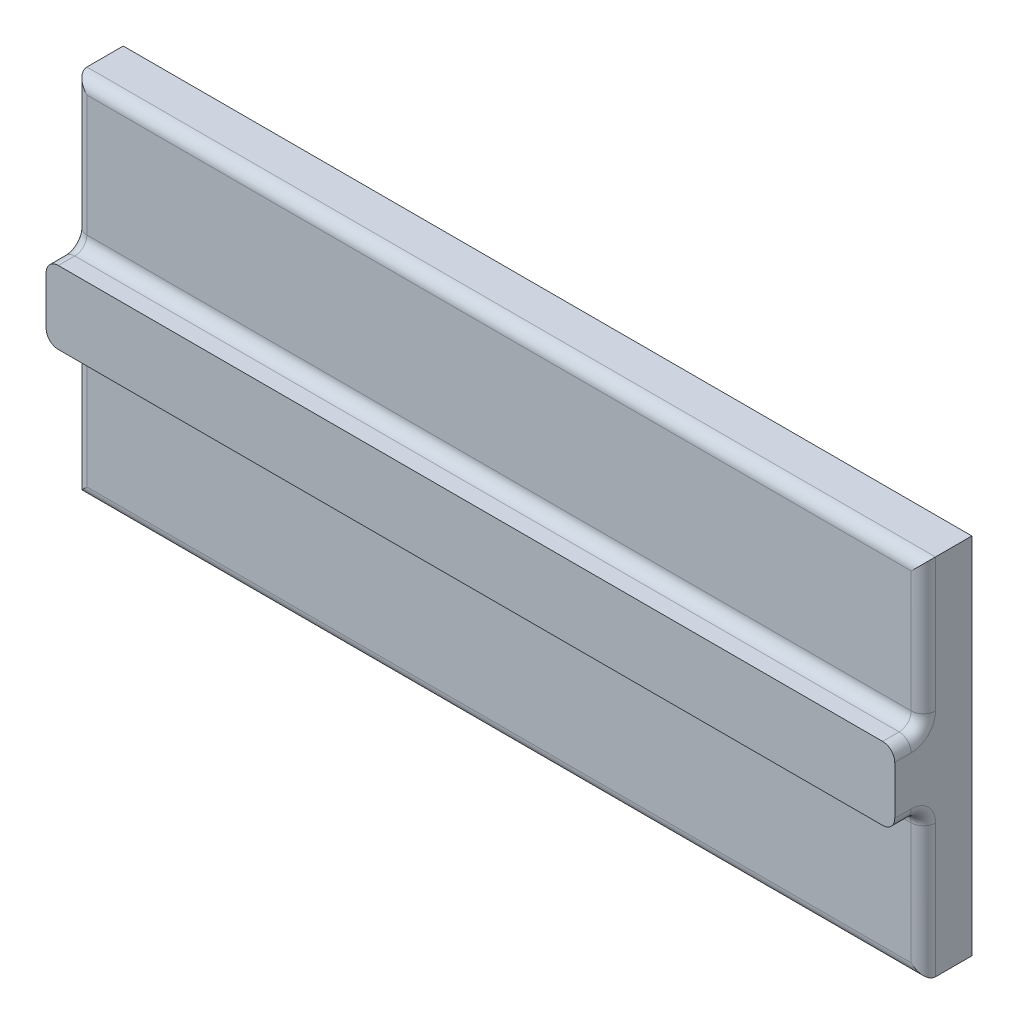
ISO-10303-21;
HEADER;
FILE_DESCRIPTION(('STEP AP214'),'2;1');
FILE_NAME('part.step','',(''),(''),'','','');
FILE_SCHEMA(('AUTOMOTIVE_DESIGN { 1 0 10303 214 1 1 1 1 }'));
ENDSEC;
DATA;
#1=APPLICATION_CONTEXT('core data for automotive mechanical design processes');
#2=APPLICATION_PROTOCOL_DEFINITION('international standard','automotive_design',2000,#1);
#3=PRODUCT_CONTEXT('',#1,'mechanical');
#4=PRODUCT('Part','Part','',(#3));
#5=PRODUCT_RELATED_PRODUCT_CATEGORY('part','',(#4));
#6=PRODUCT_DEFINITION_FORMATION('','',#4);
#7=PRODUCT_DEFINITION_CONTEXT('part definition',#1,'design');
#8=PRODUCT_DEFINITION('design','',#6,#7);
#9=PRODUCT_DEFINITION_SHAPE('','',#8);
#10=(LENGTH_UNIT() NAMED_UNIT(*) SI_UNIT(.MILLI.,.METRE.));
#11=(NAMED_UNIT(*) PLANE_ANGLE_UNIT() SI_UNIT($,.RADIAN.));
#12=(NAMED_UNIT(*) SI_UNIT($,.STERADIAN.) SOLID_ANGLE_UNIT());
#13=UNCERTAINTY_MEASURE_WITH_UNIT(LENGTH_MEASURE(1.E-05),#10,'distance_accuracy_value','');
#14=(GEOMETRIC_REPRESENTATION_CONTEXT(3) GLOBAL_UNCERTAINTY_ASSIGNED_CONTEXT((#13)) GLOBAL_UNIT_ASSIGNED_CONTEXT((#10,
#11,#12)) REPRESENTATION_CONTEXT('',''));
#15=CARTESIAN_POINT('',(0.,0.,0.));
#16=DIRECTION('',(0.,0.,1.));
#17=DIRECTION('',(1.,0.,0.));
#18=AXIS2_PLACEMENT_3D('',#15,#16,#17);
#19=CARTESIAN_POINT('',(175.,15.,10.));
#20=DIRECTION('',(0.,0.,-1.));
#21=DIRECTION('',(-1.,0.,0.));
#22=AXIS2_PLACEMENT_3D('',#19,#20,#21);
#23=PLANE('',#22);
#24=DIRECTION('',(0.,-1.,0.));
#25=VECTOR('',#24,1.);
#26=CARTESIAN_POINT('',(170.,75.,10.));
#27=LINE('',#26,#25);
#28=CARTESIAN_POINT('',(170.,20.,10.));
#29=VERTEX_POINT('',#28);
#30=CARTESIAN_POINT('',(170.,70.,10.));
#31=VERTEX_POINT('',#30);
#32=EDGE_CURVE('E307',#29,#31,#27,.F.);
#33=ORIENTED_EDGE('',*,*,#32,.T.);
#34=DIRECTION('',(-1.,0.,0.));
#35=VECTOR('',#34,1.);
#36=CARTESIAN_POINT('',(175.,70.,10.));
#37=LINE('',#36,#35);
#38=CARTESIAN_POINT('',(-170.,70.,10.));
#39=VERTEX_POINT('',#38);
#40=EDGE_CURVE('E310',#31,#39,#37,.T.);
#41=ORIENTED_EDGE('',*,*,#40,.T.);
#42=DIRECTION('',(0.,-1.,0.));
#43=VECTOR('',#42,1.);
#44=CARTESIAN_POINT('',(-170.,15.,10.));
#45=LINE('',#44,#43);
#46=CARTESIAN_POINT('',(-170.,20.,10.));
#47=VERTEX_POINT('',#46);
#48=EDGE_CURVE('E301',#39,#47,#45,.T.);
#49=ORIENTED_EDGE('',*,*,#48,.T.);
#50=DIRECTION('',(-1.,0.,0.));
#51=VECTOR('',#50,1.);
#52=CARTESIAN_POINT('',(175.,20.,10.));
#53=LINE('',#52,#51);
#54=EDGE_CURVE('E304',#47,#29,#53,.F.);
#55=ORIENTED_EDGE('',*,*,#54,.T.);
#56=EDGE_LOOP('',(#33,#41,#49,#55));
#57=FACE_BOUND('',#56,.T.);
#58=ADVANCED_FACE('F45',(#57),#23,.F.);
#59=CARTESIAN_POINT('',(175.,15.,21.7896129729729));
#60=DIRECTION('',(0.,-1.,0.));
#61=DIRECTION('',(0.,0.,-1.));
#62=AXIS2_PLACEMENT_3D('',#59,#60,#61);
#63=PLANE('',#62);
#64=DIRECTION('',(-1.,0.,0.));
#65=VECTOR('',#64,1.);
#66=CARTESIAN_POINT('',(175.,15.,21.7896129729729));
#67=LINE('',#66,#65);
#68=CARTESIAN_POINT('',(170.,15.,21.7896129729729));
#69=VERTEX_POINT('',#68);
#70=CARTESIAN_POINT('',(-170.,15.,21.7896129729729));
#71=VERTEX_POINT('',#70);
#72=EDGE_CURVE('E227',#69,#71,#67,.T.);
#73=ORIENTED_EDGE('',*,*,#72,.F.);
#74=DIRECTION('',(0.,0.,1.));
#75=VECTOR('',#74,1.);
#76=CARTESIAN_POINT('',(170.,15.,10.));
#77=LINE('',#76,#75);
#78=CARTESIAN_POINT('',(170.,15.,15.));
#79=VERTEX_POINT('',#78);
#80=EDGE_CURVE('E269',#69,#79,#77,.F.);
#81=ORIENTED_EDGE('',*,*,#80,.T.);
#82=DIRECTION('',(-1.,0.,0.));
#83=VECTOR('',#82,1.);
#84=CARTESIAN_POINT('',(-175.,15.,15.));
#85=LINE('',#84,#83);
#86=CARTESIAN_POINT('',(-170.,15.,15.));
#87=VERTEX_POINT('',#86);
#88=EDGE_CURVE('E263',#79,#87,#85,.T.);
#89=ORIENTED_EDGE('',*,*,#88,.T.);
#90=DIRECTION('',(0.,0.,1.));
#91=VECTOR('',#90,1.);
#92=CARTESIAN_POINT('',(-170.,15.,21.7896129729729));
#93=LINE('',#92,#91);
#94=EDGE_CURVE('E266',#87,#71,#93,.T.);
#95=ORIENTED_EDGE('',*,*,#94,.T.);
#96=EDGE_LOOP('',(#73,#81,#89,#95));
#97=FACE_BOUND('',#96,.T.);
#98=ADVANCED_FACE('F448',(#97),#63,.F.);
#99=CARTESIAN_POINT('',(175.,0.,21.7896129729729));
#100=DIRECTION('',(0.,0.,-1.));
#101=DIRECTION('',(-1.,0.,0.));
#102=AXIS2_PLACEMENT_3D('',#99,#100,#101);
#103=PLANE('',#102);
#104=DIRECTION('',(0.,-1.,0.));
#105=VECTOR('',#104,1.);
#106=CARTESIAN_POINT('',(175.,0.,21.7896129729729));
#107=LINE('',#106,#105);
#108=CARTESIAN_POINT('',(175.,10.,21.7896129729729));
#109=VERTEX_POINT('',#108);
#110=CARTESIAN_POINT('',(175.,-9.99999999999997,21.7896129729729));
#111=VERTEX_POINT('',#110);
#112=EDGE_CURVE('E183',#109,#111,#107,.T.);
#113=ORIENTED_EDGE('',*,*,#112,.F.);
#114=CARTESIAN_POINT('',(170.,10.,21.7896129729729));
#115=DIRECTION('',(0.,0.,-1.));
#116=DIRECTION('',(-1.,0.,0.));
#117=AXIS2_PLACEMENT_3D('',#114,#115,#116);
#118=CIRCLE('',#117,5.);
#119=EDGE_CURVE('E260',#109,#69,#118,.F.);
#120=ORIENTED_EDGE('',*,*,#119,.T.);
#121=ORIENTED_EDGE('',*,*,#72,.T.);
#122=CARTESIAN_POINT('',(-170.,10.,21.7896129729729));
#123=DIRECTION('',(0.,0.,-1.));
#124=DIRECTION('',(-1.,0.,0.));
#125=AXIS2_PLACEMENT_3D('',#122,#123,#124);
#126=CIRCLE('',#125,5.);
#127=CARTESIAN_POINT('',(-175.,10.,21.7896129729729));
#128=VERTEX_POINT('',#127);
#129=EDGE_CURVE('E258',#71,#128,#126,.F.);
#130=ORIENTED_EDGE('',*,*,#129,.T.);
#131=DIRECTION('',(0.,-1.,0.));
#132=VECTOR('',#131,1.);
#133=CARTESIAN_POINT('',(-175.,0.,21.7896129729729));
#134=LINE('',#133,#132);
#135=CARTESIAN_POINT('',(-175.,-9.99999999999997,21.7896129729729));
#136=VERTEX_POINT('',#135);
#137=EDGE_CURVE('E208',#128,#136,#134,.T.);
#138=ORIENTED_EDGE('',*,*,#137,.T.);
#139=CARTESIAN_POINT('',(-170.,-9.99999999999997,21.7896129729729));
#140=DIRECTION('',(0.,0.,-1.));
#141=DIRECTION('',(-1.,0.,0.));
#142=AXIS2_PLACEMENT_3D('',#139,#140,#141);
#143=CIRCLE('',#142,5.);
#144=CARTESIAN_POINT('',(-170.,-15.,21.7896129729729));
#145=VERTEX_POINT('',#144);
#146=EDGE_CURVE('E252',#136,#145,#143,.F.);
#147=ORIENTED_EDGE('',*,*,#146,.T.);
#148=DIRECTION('',(-1.,0.,0.));
#149=VECTOR('',#148,1.);
#150=CARTESIAN_POINT('',(175.,-15.,21.7896129729729));
#151=LINE('',#150,#149);
#152=CARTESIAN_POINT('',(170.,-15.,21.7896129729729));
#153=VERTEX_POINT('',#152);
#154=EDGE_CURVE('E193',#153,#145,#151,.T.);
#155=ORIENTED_EDGE('',*,*,#154,.F.);
#156=CARTESIAN_POINT('',(170.,-9.99999999999997,21.7896129729729));
#157=DIRECTION('',(0.,0.,-1.));
#158=DIRECTION('',(-1.,0.,0.));
#159=AXIS2_PLACEMENT_3D('',#156,#157,#158);
#160=CIRCLE('',#159,5.);
#161=EDGE_CURVE('E255',#153,#111,#160,.F.);
#162=ORIENTED_EDGE('',*,*,#161,.T.);
#163=EDGE_LOOP('',(#113,#120,#121,#130,#138,#147,#155,#162));
#164=FACE_BOUND('',#163,.T.);
#165=ADVANCED_FACE('F418',(#164),#103,.F.);
#166=CARTESIAN_POINT('',(175.,-15.,21.7896129729729));
#167=DIRECTION('',(0.,1.,0.));
#168=DIRECTION('',(0.,0.,1.));
#169=AXIS2_PLACEMENT_3D('',#166,#167,#168);
#170=PLANE('',#169);
#171=DIRECTION('',(-1.,0.,0.));
#172=VECTOR('',#171,1.);
#173=CARTESIAN_POINT('',(175.,-15.,15.));
#174=LINE('',#173,#172);
#175=CARTESIAN_POINT('',(-170.,-15.,15.));
#176=VERTEX_POINT('',#175);
#177=CARTESIAN_POINT('',(170.,-15.,15.));
#178=VERTEX_POINT('',#177);
#179=EDGE_CURVE('E292',#176,#178,#174,.F.);
#180=ORIENTED_EDGE('',*,*,#179,.T.);
#181=DIRECTION('',(0.,0.,-1.));
#182=VECTOR('',#181,1.);
#183=CARTESIAN_POINT('',(170.,-15.,21.7896129729729));
#184=LINE('',#183,#182);
#185=EDGE_CURVE('E298',#178,#153,#184,.F.);
#186=ORIENTED_EDGE('',*,*,#185,.T.);
#187=ORIENTED_EDGE('',*,*,#154,.T.);
#188=DIRECTION('',(0.,0.,-1.));
#189=VECTOR('',#188,1.);
#190=CARTESIAN_POINT('',(-170.,-15.,21.7896129729729));
#191=LINE('',#190,#189);
#192=EDGE_CURVE('E295',#145,#176,#191,.T.);
#193=ORIENTED_EDGE('',*,*,#192,.T.);
#194=EDGE_LOOP('',(#180,#186,#187,#193));
#195=FACE_BOUND('',#194,.T.);
#196=ADVANCED_FACE('F438',(#195),#170,.F.);
#197=CARTESIAN_POINT('',(175.,-75.,10.));
#198=DIRECTION('',(0.,0.,-1.));
#199=DIRECTION('',(-1.,0.,0.));
#200=AXIS2_PLACEMENT_3D('',#197,#198,#199);
#201=PLANE('',#200);
#202=DIRECTION('',(0.,-1.,0.));
#203=VECTOR('',#202,1.);
#204=CARTESIAN_POINT('',(170.,-15.,10.));
#205=LINE('',#204,#203);
#206=CARTESIAN_POINT('',(170.,-70.,10.));
#207=VERTEX_POINT('',#206);
#208=CARTESIAN_POINT('',(170.,-20.,10.));
#209=VERTEX_POINT('',#208);
#210=EDGE_CURVE('E63',#207,#209,#205,.F.);
#211=ORIENTED_EDGE('',*,*,#210,.T.);
#212=DIRECTION('',(-1.,0.,0.));
#213=VECTOR('',#212,1.);
#214=CARTESIAN_POINT('',(-175.,-20.,10.));
#215=LINE('',#214,#213);
#216=CARTESIAN_POINT('',(-170.,-20.,10.));
#217=VERTEX_POINT('',#216);
#218=EDGE_CURVE('E55',#209,#217,#215,.T.);
#219=ORIENTED_EDGE('',*,*,#218,.T.);
#220=DIRECTION('',(0.,-1.,0.));
#221=VECTOR('',#220,1.);
#222=CARTESIAN_POINT('',(-170.,-75.,10.));
#223=LINE('',#222,#221);
#224=CARTESIAN_POINT('',(-170.,-70.,10.));
#225=VERTEX_POINT('',#224);
#226=EDGE_CURVE('E317',#217,#225,#223,.T.);
#227=ORIENTED_EDGE('',*,*,#226,.T.);
#228=DIRECTION('',(-1.,0.,0.));
#229=VECTOR('',#228,1.);
#230=CARTESIAN_POINT('',(175.,-70.,10.));
#231=LINE('',#230,#229);
#232=EDGE_CURVE('E68',#225,#207,#231,.F.);
#233=ORIENTED_EDGE('',*,*,#232,.T.);
#234=EDGE_LOOP('',(#211,#219,#227,#233));
#235=FACE_BOUND('',#234,.T.);
#236=ADVANCED_FACE('F436',(#235),#201,.F.);
#237=CARTESIAN_POINT('',(175.,-75.,-10.));
#238=DIRECTION('',(0.,1.,0.));
#239=DIRECTION('',(0.,0.,1.));
#240=AXIS2_PLACEMENT_3D('',#237,#238,#239);
#241=PLANE('',#240);
#242=DIRECTION('',(0.,0.,-1.));
#243=VECTOR('',#242,1.);
#244=CARTESIAN_POINT('',(175.,-75.,-10.));
#245=LINE('',#244,#243);
#246=CARTESIAN_POINT('',(175.,-75.,5.));
#247=VERTEX_POINT('',#246);
#248=CARTESIAN_POINT('',(175.,-75.,-10.));
#249=VERTEX_POINT('',#248);
#250=EDGE_CURVE('E171',#247,#249,#245,.T.);
#251=ORIENTED_EDGE('',*,*,#250,.F.);
#252=DIRECTION('',(-1.,0.,0.));
#253=VECTOR('',#252,1.);
#254=CARTESIAN_POINT('',(175.,-75.,5.));
#255=LINE('',#254,#253);
#256=CARTESIAN_POINT('',(-175.,-75.,5.));
#257=VERTEX_POINT('',#256);
#258=EDGE_CURVE('E11',#247,#257,#255,.T.);
#259=ORIENTED_EDGE('',*,*,#258,.T.);
#260=DIRECTION('',(0.,0.,-1.));
#261=VECTOR('',#260,1.);
#262=CARTESIAN_POINT('',(-175.,-75.,-10.));
#263=LINE('',#262,#261);
#264=CARTESIAN_POINT('',(-175.,-75.,-10.));
#265=VERTEX_POINT('',#264);
#266=EDGE_CURVE('E189',#257,#265,#263,.T.);
#267=ORIENTED_EDGE('',*,*,#266,.T.);
#268=DIRECTION('',(-1.,0.,0.));
#269=VECTOR('',#268,1.);
#270=CARTESIAN_POINT('',(175.,-75.,-10.));
#271=LINE('',#270,#269);
#272=EDGE_CURVE('E186',#249,#265,#271,.T.);
#273=ORIENTED_EDGE('',*,*,#272,.F.);
#274=EDGE_LOOP('',(#251,#259,#267,#273));
#275=FACE_BOUND('',#274,.T.);
#276=ADVANCED_FACE('F187',(#275),#241,.F.);
#277=CARTESIAN_POINT('',(175.,-75.,-10.));
#278=DIRECTION('',(0.,0.,1.));
#279=DIRECTION('',(1.,0.,0.));
#280=AXIS2_PLACEMENT_3D('',#277,#278,#279);
#281=PLANE('',#280);
#282=DIRECTION('',(0.,1.,0.));
#283=VECTOR('',#282,1.);
#284=CARTESIAN_POINT('',(-175.,-75.,-10.));
#285=LINE('',#284,#283);
#286=CARTESIAN_POINT('',(-175.,75.,-10.));
#287=VERTEX_POINT('',#286);
#288=EDGE_CURVE('E215',#265,#287,#285,.T.);
#289=ORIENTED_EDGE('',*,*,#288,.T.);
#290=DIRECTION('',(-1.,0.,0.));
#291=VECTOR('',#290,1.);
#292=CARTESIAN_POINT('',(175.,75.,-10.));
#293=LINE('',#292,#291);
#294=CARTESIAN_POINT('',(175.,75.,-10.));
#295=VERTEX_POINT('',#294);
#296=EDGE_CURVE('E194',#295,#287,#293,.T.);
#297=ORIENTED_EDGE('',*,*,#296,.F.);
#298=DIRECTION('',(0.,1.,0.));
#299=VECTOR('',#298,1.);
#300=CARTESIAN_POINT('',(175.,-75.,-10.));
#301=LINE('',#300,#299);
#302=EDGE_CURVE('E176',#249,#295,#301,.T.);
#303=ORIENTED_EDGE('',*,*,#302,.F.);
#304=ORIENTED_EDGE('',*,*,#272,.T.);
#305=EDGE_LOOP('',(#289,#297,#303,#304));
#306=FACE_BOUND('',#305,.T.);
#307=ADVANCED_FACE('F196',(#306),#281,.F.);
#308=CARTESIAN_POINT('',(175.,75.,-10.));
#309=DIRECTION('',(0.,-1.,0.));
#310=DIRECTION('',(0.,0.,-1.));
#311=AXIS2_PLACEMENT_3D('',#308,#309,#310);
#312=PLANE('',#311);
#313=DIRECTION('',(0.,0.,1.));
#314=VECTOR('',#313,1.);
#315=CARTESIAN_POINT('',(-175.,75.,-10.));
#316=LINE('',#315,#314);
#317=CARTESIAN_POINT('',(-175.,75.,5.));
#318=VERTEX_POINT('',#317);
#319=EDGE_CURVE('E218',#287,#318,#316,.T.);
#320=ORIENTED_EDGE('',*,*,#319,.T.);
#321=DIRECTION('',(-1.,0.,0.));
#322=VECTOR('',#321,1.);
#323=CARTESIAN_POINT('',(175.,75.,5.));
#324=LINE('',#323,#322);
#325=CARTESIAN_POINT('',(175.,75.,5.));
#326=VERTEX_POINT('',#325);
#327=EDGE_CURVE('E314',#318,#326,#324,.F.);
#328=ORIENTED_EDGE('',*,*,#327,.T.);
#329=DIRECTION('',(0.,0.,1.));
#330=VECTOR('',#329,1.);
#331=CARTESIAN_POINT('',(175.,75.,-10.));
#332=LINE('',#331,#330);
#333=EDGE_CURVE('E200',#295,#326,#332,.T.);
#334=ORIENTED_EDGE('',*,*,#333,.F.);
#335=ORIENTED_EDGE('',*,*,#296,.T.);
#336=EDGE_LOOP('',(#320,#328,#334,#335));
#337=FACE_BOUND('',#336,.T.);
#338=ADVANCED_FACE('F396',(#337),#312,.F.);
#339=CARTESIAN_POINT('',(175.,0.,0.));
#340=DIRECTION('',(1.,0.,0.));
#341=DIRECTION('',(0.,0.,-1.));
#342=AXIS2_PLACEMENT_3D('',#339,#340,#341);
#343=PLANE('',#342);
#344=CARTESIAN_POINT('',(175.,20.,15.));
#345=DIRECTION('',(1.,0.,0.));
#346=DIRECTION('',(0.,0.,-1.));
#347=AXIS2_PLACEMENT_3D('',#344,#345,#346);
#348=CIRCLE('',#347,10.);
#349=CARTESIAN_POINT('',(175.,10.,15.));
#350=VERTEX_POINT('',#349);
#351=CARTESIAN_POINT('',(175.,20.,5.));
#352=VERTEX_POINT('',#351);
#353=EDGE_CURVE('E241',#350,#352,#348,.T.);
#354=ORIENTED_EDGE('',*,*,#353,.F.);
#355=DIRECTION('',(0.,0.,1.));
#356=VECTOR('',#355,1.);
#357=CARTESIAN_POINT('',(175.,10.,21.7896129729729));
#358=LINE('',#357,#356);
#359=EDGE_CURVE('E248',#350,#109,#358,.T.);
#360=ORIENTED_EDGE('',*,*,#359,.T.);
#361=ORIENTED_EDGE('',*,*,#112,.T.);
#362=DIRECTION('',(0.,0.,-1.));
#363=VECTOR('',#362,1.);
#364=CARTESIAN_POINT('',(175.,-9.99999999999997,10.));
#365=LINE('',#364,#363);
#366=CARTESIAN_POINT('',(175.,-9.99999999999997,15.));
#367=VERTEX_POINT('',#366);
#368=EDGE_CURVE('E237',#111,#367,#365,.T.);
#369=ORIENTED_EDGE('',*,*,#368,.T.);
#370=CARTESIAN_POINT('',(175.,-20.,15.));
#371=DIRECTION('',(1.,0.,0.));
#372=DIRECTION('',(0.,0.,-1.));
#373=AXIS2_PLACEMENT_3D('',#370,#371,#372);
#374=CIRCLE('',#373,10.);
#375=CARTESIAN_POINT('',(175.,-20.,5.));
#376=VERTEX_POINT('',#375);
#377=EDGE_CURVE('E233',#376,#367,#374,.T.);
#378=ORIENTED_EDGE('',*,*,#377,.F.);
#379=DIRECTION('',(0.,-1.,0.));
#380=VECTOR('',#379,1.);
#381=CARTESIAN_POINT('',(175.,-75.,5.));
#382=LINE('',#381,#380);
#383=EDGE_CURVE('E179',#376,#247,#382,.T.);
#384=ORIENTED_EDGE('',*,*,#383,.T.);
#385=ORIENTED_EDGE('',*,*,#250,.T.);
#386=ORIENTED_EDGE('',*,*,#302,.T.);
#387=ORIENTED_EDGE('',*,*,#333,.T.);
#388=DIRECTION('',(0.,-1.,0.));
#389=VECTOR('',#388,1.);
#390=CARTESIAN_POINT('',(175.,15.,5.));
#391=LINE('',#390,#389);
#392=EDGE_CURVE('E245',#326,#352,#391,.T.);
#393=ORIENTED_EDGE('',*,*,#392,.T.);
#394=EDGE_LOOP('',(#354,#360,#361,#369,#378,#384,#385,#386,#387,#393));
#395=FACE_BOUND('',#394,.T.);
#396=ADVANCED_FACE('F173',(#395),#343,.T.);
#397=CARTESIAN_POINT('',(-175.,0.,0.));
#398=DIRECTION('',(1.,0.,0.));
#399=DIRECTION('',(0.,0.,-1.));
#400=AXIS2_PLACEMENT_3D('',#397,#398,#399);
#401=PLANE('',#400);
#402=ORIENTED_EDGE('',*,*,#137,.F.);
#403=DIRECTION('',(0.,0.,1.));
#404=VECTOR('',#403,1.);
#405=CARTESIAN_POINT('',(-175.,10.,0.));
#406=LINE('',#405,#404);
#407=CARTESIAN_POINT('',(-175.,10.,15.));
#408=VERTEX_POINT('',#407);
#409=EDGE_CURVE('E289',#128,#408,#406,.F.);
#410=ORIENTED_EDGE('',*,*,#409,.T.);
#411=CARTESIAN_POINT('',(-175.,20.,15.));
#412=DIRECTION('',(1.,0.,0.));
#413=DIRECTION('',(0.,0.,-1.));
#414=AXIS2_PLACEMENT_3D('',#411,#412,#413);
#415=CIRCLE('',#414,10.);
#416=CARTESIAN_POINT('',(-175.,20.,5.));
#417=VERTEX_POINT('',#416);
#418=EDGE_CURVE('E285',#417,#408,#415,.F.);
#419=ORIENTED_EDGE('',*,*,#418,.F.);
#420=DIRECTION('',(0.,-1.,0.));
#421=VECTOR('',#420,1.);
#422=CARTESIAN_POINT('',(-175.,0.,5.));
#423=LINE('',#422,#421);
#424=EDGE_CURVE('E282',#417,#318,#423,.F.);
#425=ORIENTED_EDGE('',*,*,#424,.T.);
#426=ORIENTED_EDGE('',*,*,#319,.F.);
#427=ORIENTED_EDGE('',*,*,#288,.F.);
#428=ORIENTED_EDGE('',*,*,#266,.F.);
#429=DIRECTION('',(0.,-1.,0.));
#430=VECTOR('',#429,1.);
#431=CARTESIAN_POINT('',(-175.,0.,5.));
#432=LINE('',#431,#430);
#433=CARTESIAN_POINT('',(-175.,-20.,5.));
#434=VERTEX_POINT('',#433);
#435=EDGE_CURVE('E276',#257,#434,#432,.F.);
#436=ORIENTED_EDGE('',*,*,#435,.T.);
#437=CARTESIAN_POINT('',(-175.,-20.,15.));
#438=DIRECTION('',(1.,0.,0.));
#439=DIRECTION('',(0.,0.,-1.));
#440=AXIS2_PLACEMENT_3D('',#437,#438,#439);
#441=CIRCLE('',#440,10.);
#442=CARTESIAN_POINT('',(-175.,-9.99999999999997,15.));
#443=VERTEX_POINT('',#442);
#444=EDGE_CURVE('E272',#443,#434,#441,.F.);
#445=ORIENTED_EDGE('',*,*,#444,.F.);
#446=DIRECTION('',(0.,0.,-1.));
#447=VECTOR('',#446,1.);
#448=CARTESIAN_POINT('',(-175.,-9.99999999999997,0.));
#449=LINE('',#448,#447);
#450=EDGE_CURVE('E279',#443,#136,#449,.F.);
#451=ORIENTED_EDGE('',*,*,#450,.T.);
#452=EDGE_LOOP('',(#402,#410,#419,#425,#426,#427,#428,#436,#445,#451));
#453=FACE_BOUND('',#452,.T.);
#454=ADVANCED_FACE('F392',(#453),#401,.F.);
#455=CARTESIAN_POINT('',(-170.,10.,21.7896129729729));
#456=DIRECTION('',(0.,0.,1.));
#457=DIRECTION('',(1.,0.,0.));
#458=AXIS2_PLACEMENT_3D('',#455,#456,#457);
#459=CYLINDRICAL_SURFACE('',#458,5.);
#460=ORIENTED_EDGE('',*,*,#129,.F.);
#461=ORIENTED_EDGE('',*,*,#94,.F.);
#462=CARTESIAN_POINT('',(-170.,10.,15.));
#463=DIRECTION('',(0.,0.,-1.));
#464=DIRECTION('',(-1.,0.,0.));
#465=AXIS2_PLACEMENT_3D('',#462,#463,#464);
#466=CIRCLE('',#465,5.);
#467=EDGE_CURVE('E212',#408,#87,#466,.T.);
#468=ORIENTED_EDGE('',*,*,#467,.F.);
#469=ORIENTED_EDGE('',*,*,#409,.F.);
#470=EDGE_LOOP('',(#460,#461,#468,#469));
#471=FACE_BOUND('',#470,.T.);
#472=ADVANCED_FACE('F478',(#471),#459,.T.);
#473=CARTESIAN_POINT('',(-170.,15.,5.));
#474=DIRECTION('',(0.,-1.,0.));
#475=DIRECTION('',(0.,0.,-1.));
#476=AXIS2_PLACEMENT_3D('',#473,#474,#475);
#477=CYLINDRICAL_SURFACE('',#476,5.);
#478=CARTESIAN_POINT('',(-170.,70.,5.));
#479=DIRECTION('',(-0.707106781186547,-0.707106781186547,0.));
#480=DIRECTION('',(0.707106781186547,-0.707106781186547,0.));
#481=AXIS2_PLACEMENT_3D('',#478,#479,#480);
#482=ELLIPSE('',#481,7.07106781186547,5.);
#483=EDGE_CURVE('E345',#318,#39,#482,.F.);
#484=ORIENTED_EDGE('',*,*,#483,.F.);
#485=ORIENTED_EDGE('',*,*,#424,.F.);
#486=CARTESIAN_POINT('',(-170.,20.,5.));
#487=DIRECTION('',(0.,-1.,0.));
#488=DIRECTION('',(0.,0.,-1.));
#489=AXIS2_PLACEMENT_3D('',#486,#487,#488);
#490=CIRCLE('',#489,5.);
#491=EDGE_CURVE('E348',#47,#417,#490,.T.);
#492=ORIENTED_EDGE('',*,*,#491,.F.);
#493=ORIENTED_EDGE('',*,*,#48,.F.);
#494=EDGE_LOOP('',(#484,#485,#492,#493));
#495=FACE_BOUND('',#494,.T.);
#496=ADVANCED_FACE('F474',(#495),#477,.T.);
#497=CARTESIAN_POINT('',(-170.,20.,15.));
#498=DIRECTION('',(1.,0.,0.));
#499=DIRECTION('',(0.,0.,-1.));
#500=AXIS2_PLACEMENT_3D('',#497,#498,#499);
#501=TOROIDAL_SURFACE('',#500,10.,5.);
#502=ORIENTED_EDGE('',*,*,#418,.T.);
#503=ORIENTED_EDGE('',*,*,#467,.T.);
#504=CARTESIAN_POINT('',(-170.,20.,15.));
#505=DIRECTION('',(1.,0.,0.));
#506=DIRECTION('',(0.,0.,-1.));
#507=AXIS2_PLACEMENT_3D('',#504,#505,#506);
#508=CIRCLE('',#507,5.);
#509=EDGE_CURVE('E341',#47,#87,#508,.F.);
#510=ORIENTED_EDGE('',*,*,#509,.F.);
#511=ORIENTED_EDGE('',*,*,#491,.T.);
#512=EDGE_LOOP('',(#502,#503,#510,#511));
#513=FACE_BOUND('',#512,.T.);
#514=ADVANCED_FACE('F471',(#513),#501,.T.);
#515=CARTESIAN_POINT('',(175.,70.,5.));
#516=DIRECTION('',(-1.,0.,0.));
#517=DIRECTION('',(0.,0.,1.));
#518=AXIS2_PLACEMENT_3D('',#515,#516,#517);
#519=CYLINDRICAL_SURFACE('',#518,5.);
#520=ORIENTED_EDGE('',*,*,#483,.T.);
#521=ORIENTED_EDGE('',*,*,#40,.F.);
#522=CARTESIAN_POINT('',(170.,70.,5.));
#523=DIRECTION('',(-0.707106781186547,0.707106781186547,0.));
#524=DIRECTION('',(0.707106781186547,0.707106781186547,0.));
#525=AXIS2_PLACEMENT_3D('',#522,#523,#524);
#526=ELLIPSE('',#525,7.07106781186547,5.);
#527=EDGE_CURVE('E337',#326,#31,#526,.F.);
#528=ORIENTED_EDGE('',*,*,#527,.F.);
#529=ORIENTED_EDGE('',*,*,#327,.F.);
#530=EDGE_LOOP('',(#520,#521,#528,#529));
#531=FACE_BOUND('',#530,.T.);
#532=ADVANCED_FACE('F404',(#531),#519,.T.);
#533=CARTESIAN_POINT('',(175.,20.,15.));
#534=DIRECTION('',(1.,0.,0.));
#535=DIRECTION('',(0.,0.,-1.));
#536=AXIS2_PLACEMENT_3D('',#533,#534,#535);
#537=CYLINDRICAL_SURFACE('',#536,5.);
#538=ORIENTED_EDGE('',*,*,#509,.T.);
#539=ORIENTED_EDGE('',*,*,#88,.F.);
#540=CARTESIAN_POINT('',(170.,20.,15.));
#541=DIRECTION('',(1.,0.,0.));
#542=DIRECTION('',(0.,0.,-1.));
#543=AXIS2_PLACEMENT_3D('',#540,#541,#542);
#544=CIRCLE('',#543,5.);
#545=EDGE_CURVE('E333',#29,#79,#544,.F.);
#546=ORIENTED_EDGE('',*,*,#545,.F.);
#547=ORIENTED_EDGE('',*,*,#54,.F.);
#548=EDGE_LOOP('',(#538,#539,#546,#547));
#549=FACE_BOUND('',#548,.T.);
#550=ADVANCED_FACE('F465',(#549),#537,.F.);
#551=CARTESIAN_POINT('',(170.,0.,5.));
#552=DIRECTION('',(0.,1.,0.));
#553=DIRECTION('',(0.,0.,1.));
#554=AXIS2_PLACEMENT_3D('',#551,#552,#553);
#555=CYLINDRICAL_SURFACE('',#554,5.);
#556=ORIENTED_EDGE('',*,*,#527,.T.);
#557=ORIENTED_EDGE('',*,*,#32,.F.);
#558=CARTESIAN_POINT('',(170.,20.,5.));
#559=DIRECTION('',(0.,-1.,0.));
#560=DIRECTION('',(0.,0.,-1.));
#561=AXIS2_PLACEMENT_3D('',#558,#559,#560);
#562=CIRCLE('',#561,5.);
#563=EDGE_CURVE('E330',#352,#29,#562,.T.);
#564=ORIENTED_EDGE('',*,*,#563,.F.);
#565=ORIENTED_EDGE('',*,*,#392,.F.);
#566=EDGE_LOOP('',(#556,#557,#564,#565));
#567=FACE_BOUND('',#566,.T.);
#568=ADVANCED_FACE('F407',(#567),#555,.T.);
#569=CARTESIAN_POINT('',(170.,20.,15.));
#570=DIRECTION('',(1.,0.,0.));
#571=DIRECTION('',(0.,0.,-1.));
#572=AXIS2_PLACEMENT_3D('',#569,#570,#571);
#573=TOROIDAL_SURFACE('',#572,10.,5.);
#574=ORIENTED_EDGE('',*,*,#563,.T.);
#575=ORIENTED_EDGE('',*,*,#545,.T.);
#576=CARTESIAN_POINT('',(170.,10.,15.));
#577=DIRECTION('',(0.,0.,-1.));
#578=DIRECTION('',(-1.,0.,0.));
#579=AXIS2_PLACEMENT_3D('',#576,#577,#578);
#580=CIRCLE('',#579,5.);
#581=EDGE_CURVE('E326',#350,#79,#580,.F.);
#582=ORIENTED_EDGE('',*,*,#581,.F.);
#583=ORIENTED_EDGE('',*,*,#353,.T.);
#584=EDGE_LOOP('',(#574,#575,#582,#583));
#585=FACE_BOUND('',#584,.T.);
#586=ADVANCED_FACE('F411',(#585),#573,.T.);
#587=CARTESIAN_POINT('',(170.,10.,0.));
#588=DIRECTION('',(0.,0.,-1.));
#589=DIRECTION('',(-1.,0.,0.));
#590=AXIS2_PLACEMENT_3D('',#587,#588,#589);
#591=CYLINDRICAL_SURFACE('',#590,5.);
#592=ORIENTED_EDGE('',*,*,#581,.T.);
#593=ORIENTED_EDGE('',*,*,#80,.F.);
#594=ORIENTED_EDGE('',*,*,#119,.F.);
#595=ORIENTED_EDGE('',*,*,#359,.F.);
#596=EDGE_LOOP('',(#592,#593,#594,#595));
#597=FACE_BOUND('',#596,.T.);
#598=ADVANCED_FACE('F458',(#597),#591,.T.);
#599=CARTESIAN_POINT('',(-170.,-75.,5.));
#600=DIRECTION('',(0.,-1.,0.));
#601=DIRECTION('',(0.,0.,-1.));
#602=AXIS2_PLACEMENT_3D('',#599,#600,#601);
#603=CYLINDRICAL_SURFACE('',#602,5.);
#604=CARTESIAN_POINT('',(-170.,-20.,5.));
#605=DIRECTION('',(0.,1.,0.));
#606=DIRECTION('',(0.,0.,1.));
#607=AXIS2_PLACEMENT_3D('',#604,#605,#606);
#608=CIRCLE('',#607,5.);
#609=EDGE_CURVE('E376',#434,#217,#608,.T.);
#610=ORIENTED_EDGE('',*,*,#609,.F.);
#611=ORIENTED_EDGE('',*,*,#435,.F.);
#612=CARTESIAN_POINT('',(-170.,-70.,5.));
#613=DIRECTION('',(0.707106781186547,-0.707106781186547,0.));
#614=DIRECTION('',(-0.707106781186547,-0.707106781186547,0.));
#615=AXIS2_PLACEMENT_3D('',#612,#613,#614);
#616=ELLIPSE('',#615,7.07106781186547,5.);
#617=EDGE_CURVE('E49',#225,#257,#616,.T.);
#618=ORIENTED_EDGE('',*,*,#617,.F.);
#619=ORIENTED_EDGE('',*,*,#226,.F.);
#620=EDGE_LOOP('',(#610,#611,#618,#619));
#621=FACE_BOUND('',#620,.T.);
#622=ADVANCED_FACE('F47',(#621),#603,.T.);
#623=CARTESIAN_POINT('',(-170.,-9.99999999999997,21.7896129729729));
#624=DIRECTION('',(0.,0.,-1.));
#625=DIRECTION('',(-1.,0.,0.));
#626=AXIS2_PLACEMENT_3D('',#623,#624,#625);
#627=CYLINDRICAL_SURFACE('',#626,5.);
#628=ORIENTED_EDGE('',*,*,#146,.F.);
#629=ORIENTED_EDGE('',*,*,#450,.F.);
#630=CARTESIAN_POINT('',(-170.,-9.99999999999997,15.));
#631=DIRECTION('',(0.,0.,-1.));
#632=DIRECTION('',(-1.,0.,0.));
#633=AXIS2_PLACEMENT_3D('',#630,#631,#632);
#634=CIRCLE('',#633,5.);
#635=EDGE_CURVE('E373',#176,#443,#634,.T.);
#636=ORIENTED_EDGE('',*,*,#635,.F.);
#637=ORIENTED_EDGE('',*,*,#192,.F.);
#638=EDGE_LOOP('',(#628,#629,#636,#637));
#639=FACE_BOUND('',#638,.T.);
#640=ADVANCED_FACE('F495',(#639),#627,.T.);
#641=CARTESIAN_POINT('',(175.,-70.,5.));
#642=DIRECTION('',(-1.,0.,0.));
#643=DIRECTION('',(0.,0.,1.));
#644=AXIS2_PLACEMENT_3D('',#641,#642,#643);
#645=CYLINDRICAL_SURFACE('',#644,5.);
#646=ORIENTED_EDGE('',*,*,#617,.T.);
#647=ORIENTED_EDGE('',*,*,#258,.F.);
#648=CARTESIAN_POINT('',(170.,-70.,5.));
#649=DIRECTION('',(-0.707106781186547,-0.707106781186547,0.));
#650=DIRECTION('',(-0.707106781186547,0.707106781186547,0.));
#651=AXIS2_PLACEMENT_3D('',#648,#649,#650);
#652=ELLIPSE('',#651,7.07106781186547,5.);
#653=EDGE_CURVE('E369',#207,#247,#652,.F.);
#654=ORIENTED_EDGE('',*,*,#653,.F.);
#655=ORIENTED_EDGE('',*,*,#232,.F.);
#656=EDGE_LOOP('',(#646,#647,#654,#655));
#657=FACE_BOUND('',#656,.T.);
#658=ADVANCED_FACE('F387',(#657),#645,.T.);
#659=CARTESIAN_POINT('',(-170.,-20.,15.));
#660=DIRECTION('',(1.,0.,0.));
#661=DIRECTION('',(0.,0.,-1.));
#662=AXIS2_PLACEMENT_3D('',#659,#660,#661);
#663=TOROIDAL_SURFACE('',#662,10.,5.);
#664=ORIENTED_EDGE('',*,*,#444,.T.);
#665=ORIENTED_EDGE('',*,*,#609,.T.);
#666=CARTESIAN_POINT('',(-170.,-20.,15.));
#667=DIRECTION('',(1.,0.,0.));
#668=DIRECTION('',(0.,0.,-1.));
#669=AXIS2_PLACEMENT_3D('',#666,#667,#668);
#670=CIRCLE('',#669,5.);
#671=EDGE_CURVE('E366',#176,#217,#670,.F.);
#672=ORIENTED_EDGE('',*,*,#671,.F.);
#673=ORIENTED_EDGE('',*,*,#635,.T.);
#674=EDGE_LOOP('',(#664,#665,#672,#673));
#675=FACE_BOUND('',#674,.T.);
#676=ADVANCED_FACE('F491',(#675),#663,.T.);
#677=CARTESIAN_POINT('',(170.,0.,5.));
#678=DIRECTION('',(0.,1.,0.));
#679=DIRECTION('',(0.,0.,1.));
#680=AXIS2_PLACEMENT_3D('',#677,#678,#679);
#681=CYLINDRICAL_SURFACE('',#680,5.);
#682=ORIENTED_EDGE('',*,*,#653,.T.);
#683=ORIENTED_EDGE('',*,*,#383,.F.);
#684=CARTESIAN_POINT('',(170.,-20.,5.));
#685=DIRECTION('',(0.,1.,0.));
#686=DIRECTION('',(0.,0.,1.));
#687=AXIS2_PLACEMENT_3D('',#684,#685,#686);
#688=CIRCLE('',#687,5.);
#689=EDGE_CURVE('E362',#209,#376,#688,.T.);
#690=ORIENTED_EDGE('',*,*,#689,.F.);
#691=ORIENTED_EDGE('',*,*,#210,.F.);
#692=EDGE_LOOP('',(#682,#683,#690,#691));
#693=FACE_BOUND('',#692,.T.);
#694=ADVANCED_FACE('F430',(#693),#681,.T.);
#695=CARTESIAN_POINT('',(175.,-20.,15.));
#696=DIRECTION('',(1.,0.,0.));
#697=DIRECTION('',(0.,0.,-1.));
#698=AXIS2_PLACEMENT_3D('',#695,#696,#697);
#699=CYLINDRICAL_SURFACE('',#698,5.);
#700=ORIENTED_EDGE('',*,*,#671,.T.);
#701=ORIENTED_EDGE('',*,*,#218,.F.);
#702=CARTESIAN_POINT('',(170.,-20.,15.));
#703=DIRECTION('',(1.,0.,0.));
#704=DIRECTION('',(0.,0.,-1.));
#705=AXIS2_PLACEMENT_3D('',#702,#703,#704);
#706=CIRCLE('',#705,5.);
#707=EDGE_CURVE('E358',#178,#209,#706,.F.);
#708=ORIENTED_EDGE('',*,*,#707,.F.);
#709=ORIENTED_EDGE('',*,*,#179,.F.);
#710=EDGE_LOOP('',(#700,#701,#708,#709));
#711=FACE_BOUND('',#710,.T.);
#712=ADVANCED_FACE('F435',(#711),#699,.F.);
#713=CARTESIAN_POINT('',(170.,-20.,15.));
#714=DIRECTION('',(1.,0.,0.));
#715=DIRECTION('',(0.,0.,-1.));
#716=AXIS2_PLACEMENT_3D('',#713,#714,#715);
#717=TOROIDAL_SURFACE('',#716,10.,5.);
#718=ORIENTED_EDGE('',*,*,#689,.T.);
#719=ORIENTED_EDGE('',*,*,#377,.T.);
#720=CARTESIAN_POINT('',(170.,-9.99999999999997,15.));
#721=DIRECTION('',(0.,0.,-1.));
#722=DIRECTION('',(-1.,0.,0.));
#723=AXIS2_PLACEMENT_3D('',#720,#721,#722);
#724=CIRCLE('',#723,5.);
#725=EDGE_CURVE('E355',#178,#367,#724,.F.);
#726=ORIENTED_EDGE('',*,*,#725,.F.);
#727=ORIENTED_EDGE('',*,*,#707,.T.);
#728=EDGE_LOOP('',(#718,#719,#726,#727));
#729=FACE_BOUND('',#728,.T.);
#730=ADVANCED_FACE('F431',(#729),#717,.T.);
#731=CARTESIAN_POINT('',(170.,-9.99999999999997,0.));
#732=DIRECTION('',(0.,0.,1.));
#733=DIRECTION('',(1.,0.,0.));
#734=AXIS2_PLACEMENT_3D('',#731,#732,#733);
#735=CYLINDRICAL_SURFACE('',#734,5.);
#736=ORIENTED_EDGE('',*,*,#161,.F.);
#737=ORIENTED_EDGE('',*,*,#185,.F.);
#738=ORIENTED_EDGE('',*,*,#725,.T.);
#739=ORIENTED_EDGE('',*,*,#368,.F.);
#740=EDGE_LOOP('',(#736,#737,#738,#739));
#741=FACE_BOUND('',#740,.T.);
#742=ADVANCED_FACE('F425',(#741),#735,.T.);
#743=CLOSED_SHELL('',(#58,#98,#165,#196,#236,#276,#307,#338,#396,#454,#472,#496,#514,#532,#550,
#568,#586,#598,#622,#640,#658,#676,#694,#712,#730,#742));
#744=MANIFOLD_SOLID_BREP('B2',#743);
#745=ADVANCED_BREP_SHAPE_REPRESENTATION('',(#18,#744),#14);
#746=SHAPE_DEFINITION_REPRESENTATION(#9,#745);
ENDSEC;
END-ISO-10303-21;
